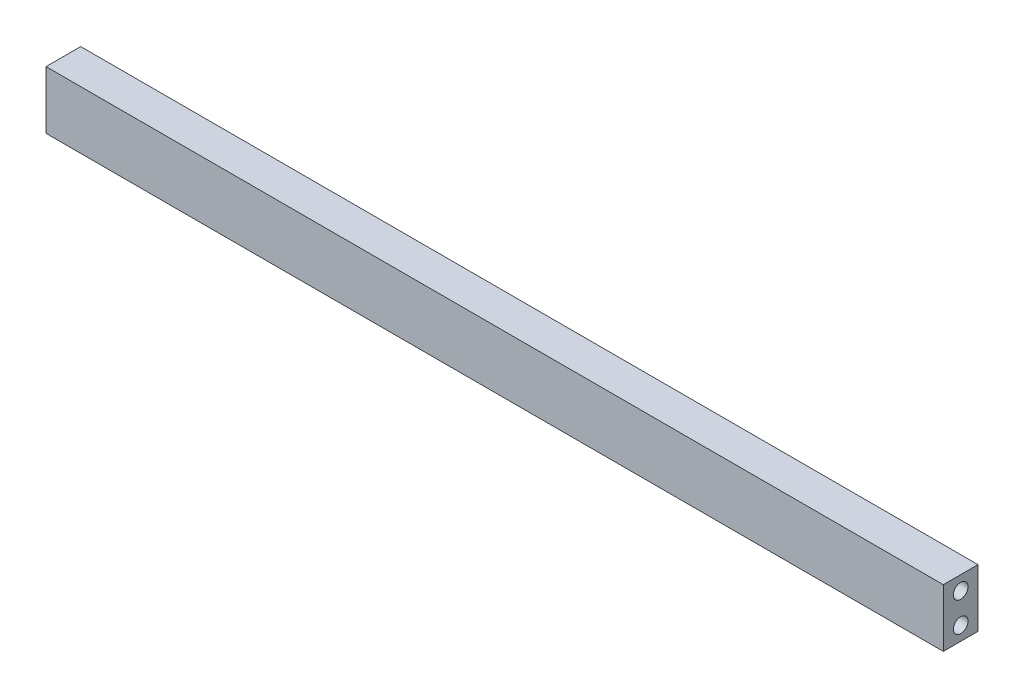
ISO-10303-21;
HEADER;
FILE_DESCRIPTION(('STEP AP214'),'2;1');
FILE_NAME('part.step','',(''),(''),'','','');
FILE_SCHEMA(('AUTOMOTIVE_DESIGN { 1 0 10303 214 1 1 1 1 }'));
ENDSEC;
DATA;
#1=APPLICATION_CONTEXT('core data for automotive mechanical design processes');
#2=APPLICATION_PROTOCOL_DEFINITION('international standard','automotive_design',2000,#1);
#3=PRODUCT_CONTEXT('',#1,'mechanical');
#4=PRODUCT('Part','Part','',(#3));
#5=PRODUCT_RELATED_PRODUCT_CATEGORY('part','',(#4));
#6=PRODUCT_DEFINITION_FORMATION('','',#4);
#7=PRODUCT_DEFINITION_CONTEXT('part definition',#1,'design');
#8=PRODUCT_DEFINITION('design','',#6,#7);
#9=PRODUCT_DEFINITION_SHAPE('','',#8);
#10=(LENGTH_UNIT() NAMED_UNIT(*) SI_UNIT(.MILLI.,.METRE.));
#11=(NAMED_UNIT(*) PLANE_ANGLE_UNIT() SI_UNIT($,.RADIAN.));
#12=(NAMED_UNIT(*) SI_UNIT($,.STERADIAN.) SOLID_ANGLE_UNIT());
#13=UNCERTAINTY_MEASURE_WITH_UNIT(LENGTH_MEASURE(1.E-05),#10,'distance_accuracy_value','');
#14=(GEOMETRIC_REPRESENTATION_CONTEXT(3) GLOBAL_UNCERTAINTY_ASSIGNED_CONTEXT((#13)) GLOBAL_UNIT_ASSIGNED_CONTEXT((#10,
#11,#12)) REPRESENTATION_CONTEXT('',''));
#15=CARTESIAN_POINT('',(0.,0.,0.));
#16=DIRECTION('',(0.,0.,1.));
#17=DIRECTION('',(1.,0.,0.));
#18=AXIS2_PLACEMENT_3D('',#15,#16,#17);
#19=CARTESIAN_POINT('',(123.19,7.9375,-4.7625));
#20=DIRECTION('',(0.,0.,1.));
#21=DIRECTION('',(0.,-1.,0.));
#22=AXIS2_PLACEMENT_3D('',#19,#20,#21);
#23=PLANE('',#22);
#24=DIRECTION('',(0.,1.,0.));
#25=VECTOR('',#24,1.);
#26=CARTESIAN_POINT('',(-123.19,7.9375,-4.7625));
#27=LINE('',#26,#25);
#28=CARTESIAN_POINT('',(-123.19,-7.9375,-4.7625));
#29=VERTEX_POINT('',#28);
#30=CARTESIAN_POINT('',(-123.19,7.9375,-4.7625));
#31=VERTEX_POINT('',#30);
#32=EDGE_CURVE('E134',#29,#31,#27,.T.);
#33=ORIENTED_EDGE('',*,*,#32,.T.);
#34=DIRECTION('',(-1.,0.,0.));
#35=VECTOR('',#34,1.);
#36=CARTESIAN_POINT('',(123.19,7.9375,-4.7625));
#37=LINE('',#36,#35);
#38=CARTESIAN_POINT('',(123.19,7.9375,-4.7625));
#39=VERTEX_POINT('',#38);
#40=EDGE_CURVE('E11',#39,#31,#37,.T.);
#41=ORIENTED_EDGE('',*,*,#40,.F.);
#42=DIRECTION('',(0.,1.,0.));
#43=VECTOR('',#42,1.);
#44=CARTESIAN_POINT('',(123.19,7.9375,-4.7625));
#45=LINE('',#44,#43);
#46=CARTESIAN_POINT('',(123.19,-7.9375,-4.7625));
#47=VERTEX_POINT('',#46);
#48=EDGE_CURVE('E135',#47,#39,#45,.T.);
#49=ORIENTED_EDGE('',*,*,#48,.F.);
#50=DIRECTION('',(-1.,0.,0.));
#51=VECTOR('',#50,1.);
#52=CARTESIAN_POINT('',(123.19,-7.9375,-4.7625));
#53=LINE('',#52,#51);
#54=EDGE_CURVE('E141',#47,#29,#53,.T.);
#55=ORIENTED_EDGE('',*,*,#54,.T.);
#56=EDGE_LOOP('',(#33,#41,#49,#55));
#57=FACE_BOUND('',#56,.T.);
#58=ADVANCED_FACE('F41',(#57),#23,.F.);
#59=CARTESIAN_POINT('',(123.19,7.9375,4.7625));
#60=DIRECTION('',(0.,-1.,0.));
#61=DIRECTION('',(0.,0.,-1.));
#62=AXIS2_PLACEMENT_3D('',#59,#60,#61);
#63=PLANE('',#62);
#64=DIRECTION('',(0.,0.,1.));
#65=VECTOR('',#64,1.);
#66=CARTESIAN_POINT('',(-123.19,7.9375,4.7625));
#67=LINE('',#66,#65);
#68=CARTESIAN_POINT('',(-123.19,7.9375,4.7625));
#69=VERTEX_POINT('',#68);
#70=EDGE_CURVE('E144',#31,#69,#67,.T.);
#71=ORIENTED_EDGE('',*,*,#70,.T.);
#72=DIRECTION('',(-1.,0.,0.));
#73=VECTOR('',#72,1.);
#74=CARTESIAN_POINT('',(123.19,7.9375,4.7625));
#75=LINE('',#74,#73);
#76=CARTESIAN_POINT('',(123.19,7.9375,4.7625));
#77=VERTEX_POINT('',#76);
#78=EDGE_CURVE('E49',#77,#69,#75,.T.);
#79=ORIENTED_EDGE('',*,*,#78,.F.);
#80=DIRECTION('',(0.,0.,1.));
#81=VECTOR('',#80,1.);
#82=CARTESIAN_POINT('',(123.19,7.9375,4.7625));
#83=LINE('',#82,#81);
#84=EDGE_CURVE('E88',#39,#77,#83,.T.);
#85=ORIENTED_EDGE('',*,*,#84,.F.);
#86=ORIENTED_EDGE('',*,*,#40,.T.);
#87=EDGE_LOOP('',(#71,#79,#85,#86));
#88=FACE_BOUND('',#87,.T.);
#89=ADVANCED_FACE('F168',(#88),#63,.F.);
#90=CARTESIAN_POINT('',(123.19,7.9375,4.7625));
#91=DIRECTION('',(0.,0.,-1.));
#92=DIRECTION('',(0.,1.,0.));
#93=AXIS2_PLACEMENT_3D('',#90,#91,#92);
#94=PLANE('',#93);
#95=DIRECTION('',(0.,-1.,0.));
#96=VECTOR('',#95,1.);
#97=CARTESIAN_POINT('',(-123.19,7.9375,4.7625));
#98=LINE('',#97,#96);
#99=CARTESIAN_POINT('',(-123.19,-7.9375,4.7625));
#100=VERTEX_POINT('',#99);
#101=EDGE_CURVE('E75',#69,#100,#98,.T.);
#102=ORIENTED_EDGE('',*,*,#101,.T.);
#103=DIRECTION('',(-1.,0.,0.));
#104=VECTOR('',#103,1.);
#105=CARTESIAN_POINT('',(123.19,-7.9375,4.7625));
#106=LINE('',#105,#104);
#107=CARTESIAN_POINT('',(123.19,-7.9375,4.7625));
#108=VERTEX_POINT('',#107);
#109=EDGE_CURVE('E149',#108,#100,#106,.T.);
#110=ORIENTED_EDGE('',*,*,#109,.F.);
#111=DIRECTION('',(0.,-1.,0.));
#112=VECTOR('',#111,1.);
#113=CARTESIAN_POINT('',(123.19,7.9375,4.7625));
#114=LINE('',#113,#112);
#115=EDGE_CURVE('E138',#77,#108,#114,.T.);
#116=ORIENTED_EDGE('',*,*,#115,.F.);
#117=ORIENTED_EDGE('',*,*,#78,.T.);
#118=EDGE_LOOP('',(#102,#110,#116,#117));
#119=FACE_BOUND('',#118,.T.);
#120=ADVANCED_FACE('F151',(#119),#94,.F.);
#121=CARTESIAN_POINT('',(123.19,-7.9375,4.7625));
#122=DIRECTION('',(0.,1.,0.));
#123=DIRECTION('',(0.,0.,1.));
#124=AXIS2_PLACEMENT_3D('',#121,#122,#123);
#125=PLANE('',#124);
#126=DIRECTION('',(0.,0.,-1.));
#127=VECTOR('',#126,1.);
#128=CARTESIAN_POINT('',(-123.19,-7.9375,4.7625));
#129=LINE('',#128,#127);
#130=EDGE_CURVE('E81',#100,#29,#129,.T.);
#131=ORIENTED_EDGE('',*,*,#130,.T.);
#132=ORIENTED_EDGE('',*,*,#54,.F.);
#133=DIRECTION('',(0.,0.,-1.));
#134=VECTOR('',#133,1.);
#135=CARTESIAN_POINT('',(123.19,-7.9375,4.7625));
#136=LINE('',#135,#134);
#137=EDGE_CURVE('E57',#108,#47,#136,.T.);
#138=ORIENTED_EDGE('',*,*,#137,.F.);
#139=ORIENTED_EDGE('',*,*,#109,.T.);
#140=EDGE_LOOP('',(#131,#132,#138,#139));
#141=FACE_BOUND('',#140,.T.);
#142=ADVANCED_FACE('F158',(#141),#125,.F.);
#143=CARTESIAN_POINT('',(123.19,0.,0.));
#144=DIRECTION('',(1.,0.,0.));
#145=DIRECTION('',(0.,0.,-1.));
#146=AXIS2_PLACEMENT_3D('',#143,#144,#145);
#147=PLANE('',#146);
#148=CARTESIAN_POINT('',(123.19,4.0894,0.));
#149=DIRECTION('',(1.,0.,0.));
#150=DIRECTION('',(0.,0.,-1.));
#151=AXIS2_PLACEMENT_3D('',#148,#149,#150);
#152=CIRCLE('',#151,2.0193);
#153=CARTESIAN_POINT('',(123.19,4.0894,-2.0193));
#154=VERTEX_POINT('',#153);
#155=EDGE_CURVE('E122',#154,#154,#152,.T.);
#156=ORIENTED_EDGE('',*,*,#155,.F.);
#157=EDGE_LOOP('',(#156));
#158=FACE_BOUND('',#157,.T.);
#159=CARTESIAN_POINT('',(123.19,-4.0894,0.));
#160=DIRECTION('',(1.,0.,0.));
#161=DIRECTION('',(0.,0.,-1.));
#162=AXIS2_PLACEMENT_3D('',#159,#160,#161);
#163=CIRCLE('',#162,2.0193);
#164=CARTESIAN_POINT('',(123.19,-4.0894,-2.0193));
#165=VERTEX_POINT('',#164);
#166=EDGE_CURVE('E128',#165,#165,#163,.T.);
#167=ORIENTED_EDGE('',*,*,#166,.F.);
#168=EDGE_LOOP('',(#167));
#169=FACE_BOUND('',#168,.T.);
#170=ORIENTED_EDGE('',*,*,#48,.T.);
#171=ORIENTED_EDGE('',*,*,#84,.T.);
#172=ORIENTED_EDGE('',*,*,#115,.T.);
#173=ORIENTED_EDGE('',*,*,#137,.T.);
#174=EDGE_LOOP('',(#170,#171,#172,#173));
#175=FACE_BOUND('',#174,.T.);
#176=ADVANCED_FACE('F160',(#158,#169,#175),#147,.T.);
#177=CARTESIAN_POINT('',(-123.19,0.,0.));
#178=DIRECTION('',(1.,0.,0.));
#179=DIRECTION('',(0.,0.,-1.));
#180=AXIS2_PLACEMENT_3D('',#177,#178,#179);
#181=PLANE('',#180);
#182=CARTESIAN_POINT('',(-123.19,4.0894,0.));
#183=DIRECTION('',(-1.,0.,0.));
#184=DIRECTION('',(0.,0.,1.));
#185=AXIS2_PLACEMENT_3D('',#182,#183,#184);
#186=CIRCLE('',#185,2.0193);
#187=CARTESIAN_POINT('',(-123.19,4.0894,2.0193));
#188=VERTEX_POINT('',#187);
#189=EDGE_CURVE('E112',#188,#188,#186,.T.);
#190=ORIENTED_EDGE('',*,*,#189,.F.);
#191=EDGE_LOOP('',(#190));
#192=FACE_BOUND('',#191,.T.);
#193=CARTESIAN_POINT('',(-123.19,-4.0894,0.));
#194=DIRECTION('',(-1.,0.,0.));
#195=DIRECTION('',(0.,0.,1.));
#196=AXIS2_PLACEMENT_3D('',#193,#194,#195);
#197=CIRCLE('',#196,2.0193);
#198=CARTESIAN_POINT('',(-123.19,-4.0894,2.0193));
#199=VERTEX_POINT('',#198);
#200=EDGE_CURVE('E111',#199,#199,#197,.T.);
#201=ORIENTED_EDGE('',*,*,#200,.F.);
#202=EDGE_LOOP('',(#201));
#203=FACE_BOUND('',#202,.T.);
#204=ORIENTED_EDGE('',*,*,#32,.F.);
#205=ORIENTED_EDGE('',*,*,#130,.F.);
#206=ORIENTED_EDGE('',*,*,#101,.F.);
#207=ORIENTED_EDGE('',*,*,#70,.F.);
#208=EDGE_LOOP('',(#204,#205,#206,#207));
#209=FACE_BOUND('',#208,.T.);
#210=ADVANCED_FACE('F154',(#192,#203,#209),#181,.F.);
#211=CARTESIAN_POINT('',(113.03,-4.0894,0.));
#212=DIRECTION('',(1.,0.,0.));
#213=DIRECTION('',(0.,0.,-1.));
#214=AXIS2_PLACEMENT_3D('',#211,#212,#213);
#215=CONICAL_SURFACE('',#214,2.0193,1.02974425867665);
#216=CARTESIAN_POINT('',(111.816682151998,-4.0894,0.));
#217=VERTEX_POINT('',#216);
#218=VERTEX_LOOP('',#217);
#219=FACE_BOUND('',#218,.T.);
#220=CARTESIAN_POINT('',(113.03,-4.0894,0.));
#221=DIRECTION('',(1.,0.,0.));
#222=DIRECTION('',(0.,0.,-1.));
#223=AXIS2_PLACEMENT_3D('',#220,#221,#222);
#224=CIRCLE('',#223,2.0193);
#225=CARTESIAN_POINT('',(113.03,-4.0894,-2.0193));
#226=VERTEX_POINT('',#225);
#227=EDGE_CURVE('E131',#226,#226,#224,.T.);
#228=ORIENTED_EDGE('',*,*,#227,.T.);
#229=EDGE_LOOP('',(#228));
#230=FACE_BOUND('',#229,.T.);
#231=ADVANCED_FACE('F201',(#219,#230),#215,.F.);
#232=CARTESIAN_POINT('',(123.19,-4.0894,0.));
#233=DIRECTION('',(1.,0.,0.));
#234=DIRECTION('',(0.,0.,-1.));
#235=AXIS2_PLACEMENT_3D('',#232,#233,#234);
#236=CYLINDRICAL_SURFACE('',#235,2.0193);
#237=ORIENTED_EDGE('',*,*,#227,.F.);
#238=EDGE_LOOP('',(#237));
#239=FACE_BOUND('',#238,.T.);
#240=ORIENTED_EDGE('',*,*,#166,.T.);
#241=EDGE_LOOP('',(#240));
#242=FACE_BOUND('',#241,.T.);
#243=ADVANCED_FACE('F206',(#239,#242),#236,.F.);
#244=CARTESIAN_POINT('',(113.03,4.0894,0.));
#245=DIRECTION('',(1.,0.,0.));
#246=DIRECTION('',(0.,0.,-1.));
#247=AXIS2_PLACEMENT_3D('',#244,#245,#246);
#248=CONICAL_SURFACE('',#247,2.0193,1.02974425867665);
#249=CARTESIAN_POINT('',(111.816682151998,4.0894,0.));
#250=VERTEX_POINT('',#249);
#251=VERTEX_LOOP('',#250);
#252=FACE_BOUND('',#251,.T.);
#253=CARTESIAN_POINT('',(113.03,4.0894,0.));
#254=DIRECTION('',(1.,0.,0.));
#255=DIRECTION('',(0.,0.,-1.));
#256=AXIS2_PLACEMENT_3D('',#253,#254,#255);
#257=CIRCLE('',#256,2.0193);
#258=CARTESIAN_POINT('',(113.03,4.0894,-2.0193));
#259=VERTEX_POINT('',#258);
#260=EDGE_CURVE('E125',#259,#259,#257,.T.);
#261=ORIENTED_EDGE('',*,*,#260,.T.);
#262=EDGE_LOOP('',(#261));
#263=FACE_BOUND('',#262,.T.);
#264=ADVANCED_FACE('F217',(#252,#263),#248,.F.);
#265=CARTESIAN_POINT('',(123.19,4.0894,0.));
#266=DIRECTION('',(1.,0.,0.));
#267=DIRECTION('',(0.,0.,-1.));
#268=AXIS2_PLACEMENT_3D('',#265,#266,#267);
#269=CYLINDRICAL_SURFACE('',#268,2.0193);
#270=ORIENTED_EDGE('',*,*,#260,.F.);
#271=EDGE_LOOP('',(#270));
#272=FACE_BOUND('',#271,.T.);
#273=ORIENTED_EDGE('',*,*,#155,.T.);
#274=EDGE_LOOP('',(#273));
#275=FACE_BOUND('',#274,.T.);
#276=ADVANCED_FACE('F228',(#272,#275),#269,.F.);
#277=CARTESIAN_POINT('',(-113.03,-4.0894,0.));
#278=DIRECTION('',(-1.,0.,0.));
#279=DIRECTION('',(0.,0.,1.));
#280=AXIS2_PLACEMENT_3D('',#277,#278,#279);
#281=CONICAL_SURFACE('',#280,2.0193,1.02974425867665);
#282=CARTESIAN_POINT('',(-111.816682151998,-4.0894,0.));
#283=VERTEX_POINT('',#282);
#284=VERTEX_LOOP('',#283);
#285=FACE_BOUND('',#284,.T.);
#286=CARTESIAN_POINT('',(-113.03,-4.0894,0.));
#287=DIRECTION('',(-1.,0.,0.));
#288=DIRECTION('',(0.,0.,1.));
#289=AXIS2_PLACEMENT_3D('',#286,#287,#288);
#290=CIRCLE('',#289,2.0193);
#291=CARTESIAN_POINT('',(-113.03,-4.0894,2.0193));
#292=VERTEX_POINT('',#291);
#293=EDGE_CURVE('E115',#292,#292,#290,.T.);
#294=ORIENTED_EDGE('',*,*,#293,.T.);
#295=EDGE_LOOP('',(#294));
#296=FACE_BOUND('',#295,.T.);
#297=ADVANCED_FACE('F239',(#285,#296),#281,.F.);
#298=CARTESIAN_POINT('',(-123.19,-4.0894,0.));
#299=DIRECTION('',(-1.,0.,0.));
#300=DIRECTION('',(0.,0.,1.));
#301=AXIS2_PLACEMENT_3D('',#298,#299,#300);
#302=CYLINDRICAL_SURFACE('',#301,2.0193);
#303=ORIENTED_EDGE('',*,*,#293,.F.);
#304=EDGE_LOOP('',(#303));
#305=FACE_BOUND('',#304,.T.);
#306=ORIENTED_EDGE('',*,*,#200,.T.);
#307=EDGE_LOOP('',(#306));
#308=FACE_BOUND('',#307,.T.);
#309=ADVANCED_FACE('F105',(#305,#308),#302,.F.);
#310=CARTESIAN_POINT('',(-113.03,4.0894,0.));
#311=DIRECTION('',(-1.,0.,0.));
#312=DIRECTION('',(0.,0.,1.));
#313=AXIS2_PLACEMENT_3D('',#310,#311,#312);
#314=CONICAL_SURFACE('',#313,2.0193,1.02974425867665);
#315=CARTESIAN_POINT('',(-111.816682151998,4.0894,0.));
#316=VERTEX_POINT('',#315);
#317=VERTEX_LOOP('',#316);
#318=FACE_BOUND('',#317,.T.);
#319=CARTESIAN_POINT('',(-113.03,4.0894,0.));
#320=DIRECTION('',(-1.,0.,0.));
#321=DIRECTION('',(0.,0.,1.));
#322=AXIS2_PLACEMENT_3D('',#319,#320,#321);
#323=CIRCLE('',#322,2.0193);
#324=CARTESIAN_POINT('',(-113.03,4.0894,2.0193));
#325=VERTEX_POINT('',#324);
#326=EDGE_CURVE('E109',#325,#325,#323,.T.);
#327=ORIENTED_EDGE('',*,*,#326,.T.);
#328=EDGE_LOOP('',(#327));
#329=FACE_BOUND('',#328,.T.);
#330=ADVANCED_FACE('F101',(#318,#329),#314,.F.);
#331=CARTESIAN_POINT('',(-123.19,4.0894,0.));
#332=DIRECTION('',(-1.,0.,0.));
#333=DIRECTION('',(0.,0.,1.));
#334=AXIS2_PLACEMENT_3D('',#331,#332,#333);
#335=CYLINDRICAL_SURFACE('',#334,2.0193);
#336=ORIENTED_EDGE('',*,*,#326,.F.);
#337=EDGE_LOOP('',(#336));
#338=FACE_BOUND('',#337,.T.);
#339=ORIENTED_EDGE('',*,*,#189,.T.);
#340=EDGE_LOOP('',(#339));
#341=FACE_BOUND('',#340,.T.);
#342=ADVANCED_FACE('F104',(#338,#341),#335,.F.);
#343=CLOSED_SHELL('',(#58,#89,#120,#142,#176,#210,#231,#243,#264,#276,#297,#309,#330,#342));
#344=MANIFOLD_SOLID_BREP('B2',#343);
#345=ADVANCED_BREP_SHAPE_REPRESENTATION('',(#18,#344),#14);
#346=SHAPE_DEFINITION_REPRESENTATION(#9,#345);
ENDSEC;
END-ISO-10303-21;
